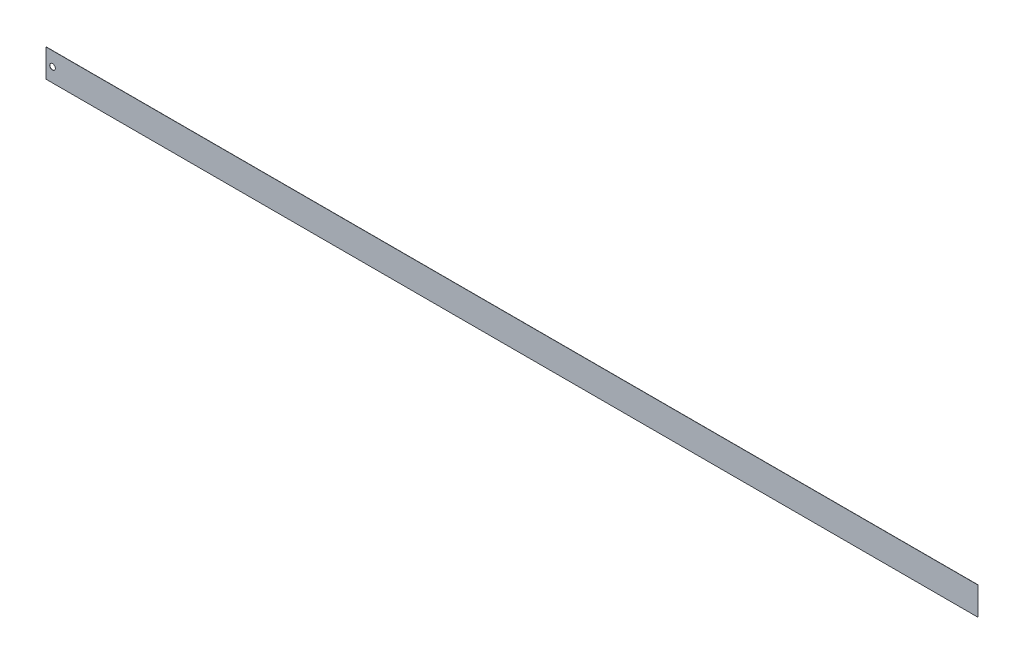
ISO-10303-21;
HEADER;
FILE_DESCRIPTION(('STEP AP214'),'2;1');
FILE_NAME('part.step','',(''),(''),'','','');
FILE_SCHEMA(('AUTOMOTIVE_DESIGN { 1 0 10303 214 1 1 1 1 }'));
ENDSEC;
DATA;
#1=APPLICATION_CONTEXT('core data for automotive mechanical design processes');
#2=APPLICATION_PROTOCOL_DEFINITION('international standard','automotive_design',2000,#1);
#3=PRODUCT_CONTEXT('',#1,'mechanical');
#4=PRODUCT('Part','Part','',(#3));
#5=PRODUCT_RELATED_PRODUCT_CATEGORY('part','',(#4));
#6=PRODUCT_DEFINITION_FORMATION('','',#4);
#7=PRODUCT_DEFINITION_CONTEXT('part definition',#1,'design');
#8=PRODUCT_DEFINITION('design','',#6,#7);
#9=PRODUCT_DEFINITION_SHAPE('','',#8);
#10=(LENGTH_UNIT() NAMED_UNIT(*) SI_UNIT(.MILLI.,.METRE.));
#11=(NAMED_UNIT(*) PLANE_ANGLE_UNIT() SI_UNIT($,.RADIAN.));
#12=(NAMED_UNIT(*) SI_UNIT($,.STERADIAN.) SOLID_ANGLE_UNIT());
#13=UNCERTAINTY_MEASURE_WITH_UNIT(LENGTH_MEASURE(1.E-05),#10,'distance_accuracy_value','');
#14=(GEOMETRIC_REPRESENTATION_CONTEXT(3) GLOBAL_UNCERTAINTY_ASSIGNED_CONTEXT((#13)) GLOBAL_UNIT_ASSIGNED_CONTEXT((#10,
#11,#12)) REPRESENTATION_CONTEXT('',''));
#15=CARTESIAN_POINT('',(0.,0.,0.));
#16=DIRECTION('',(0.,0.,1.));
#17=DIRECTION('',(1.,0.,0.));
#18=AXIS2_PLACEMENT_3D('',#15,#16,#17);
#19=CARTESIAN_POINT('',(0.,0.,0.1));
#20=DIRECTION('',(0.,0.,1.));
#21=DIRECTION('',(1.,0.,0.));
#22=AXIS2_PLACEMENT_3D('',#19,#20,#21);
#23=PLANE('',#22);
#24=DIRECTION('',(0.,-1.,0.));
#25=VECTOR('',#24,1.);
#26=CARTESIAN_POINT('',(-71.5183926645092,24.1197950377562,0.1));
#27=LINE('',#26,#25);
#28=CARTESIAN_POINT('',(-71.5183926645092,24.1197950377562,0.1));
#29=VERTEX_POINT('',#28);
#30=CARTESIAN_POINT('',(-71.5183926645092,9.1197950377562,0.1));
#31=VERTEX_POINT('',#30);
#32=EDGE_CURVE('E89',#29,#31,#27,.T.);
#33=ORIENTED_EDGE('',*,*,#32,.T.);
#34=DIRECTION('',(1.,0.,0.));
#35=VECTOR('',#34,1.);
#36=CARTESIAN_POINT('',(-71.5183926645092,9.1197950377562,0.1));
#37=LINE('',#36,#35);
#38=CARTESIAN_POINT('',(428.481607335491,9.1197950377562,0.1));
#39=VERTEX_POINT('',#38);
#40=EDGE_CURVE('E84',#31,#39,#37,.T.);
#41=ORIENTED_EDGE('',*,*,#40,.T.);
#42=DIRECTION('',(0.,1.,0.));
#43=VECTOR('',#42,1.);
#44=CARTESIAN_POINT('',(428.481607335491,24.1197950377562,0.1));
#45=LINE('',#44,#43);
#46=CARTESIAN_POINT('',(428.481607335491,24.1197950377562,0.1));
#47=VERTEX_POINT('',#46);
#48=EDGE_CURVE('E87',#39,#47,#45,.T.);
#49=ORIENTED_EDGE('',*,*,#48,.T.);
#50=DIRECTION('',(-1.,0.,0.));
#51=VECTOR('',#50,1.);
#52=CARTESIAN_POINT('',(-71.5183926645092,24.1197950377562,0.1));
#53=LINE('',#52,#51);
#54=EDGE_CURVE('E54',#47,#29,#53,.T.);
#55=ORIENTED_EDGE('',*,*,#54,.T.);
#56=EDGE_LOOP('',(#33,#41,#49,#55));
#57=FACE_BOUND('',#56,.T.);
#58=CARTESIAN_POINT('',(-68.0183926645092,16.6197950377562,0.1));
#59=DIRECTION('',(0.,0.,1.));
#60=DIRECTION('',(1.,0.,0.));
#61=AXIS2_PLACEMENT_3D('',#58,#59,#60);
#62=CIRCLE('',#61,1.5);
#63=CARTESIAN_POINT('',(-66.5183926645092,16.6197950377562,0.1));
#64=VERTEX_POINT('',#63);
#65=EDGE_CURVE('E104',#64,#64,#62,.T.);
#66=ORIENTED_EDGE('',*,*,#65,.F.);
#67=EDGE_LOOP('',(#66));
#68=FACE_BOUND('',#67,.T.);
#69=ADVANCED_FACE('F37',(#57,#68),#23,.T.);
#70=CARTESIAN_POINT('',(0.,0.,0.));
#71=DIRECTION('',(0.,0.,1.));
#72=DIRECTION('',(1.,0.,0.));
#73=AXIS2_PLACEMENT_3D('',#70,#71,#72);
#74=PLANE('',#73);
#75=DIRECTION('',(0.,-1.,0.));
#76=VECTOR('',#75,1.);
#77=CARTESIAN_POINT('',(-71.5183926645092,24.1197950377562,0.));
#78=LINE('',#77,#76);
#79=CARTESIAN_POINT('',(-71.5183926645092,24.1197950377562,0.));
#80=VERTEX_POINT('',#79);
#81=CARTESIAN_POINT('',(-71.5183926645092,9.1197950377562,0.));
#82=VERTEX_POINT('',#81);
#83=EDGE_CURVE('E101',#80,#82,#78,.T.);
#84=ORIENTED_EDGE('',*,*,#83,.F.);
#85=DIRECTION('',(-1.,0.,0.));
#86=VECTOR('',#85,1.);
#87=CARTESIAN_POINT('',(-71.5183926645092,24.1197950377562,0.));
#88=LINE('',#87,#86);
#89=CARTESIAN_POINT('',(428.481607335491,24.1197950377562,0.));
#90=VERTEX_POINT('',#89);
#91=EDGE_CURVE('E77',#90,#80,#88,.T.);
#92=ORIENTED_EDGE('',*,*,#91,.F.);
#93=DIRECTION('',(0.,1.,0.));
#94=VECTOR('',#93,1.);
#95=CARTESIAN_POINT('',(428.481607335491,24.1197950377562,0.));
#96=LINE('',#95,#94);
#97=CARTESIAN_POINT('',(428.481607335491,9.1197950377562,0.));
#98=VERTEX_POINT('',#97);
#99=EDGE_CURVE('E71',#98,#90,#96,.T.);
#100=ORIENTED_EDGE('',*,*,#99,.F.);
#101=DIRECTION('',(1.,0.,0.));
#102=VECTOR('',#101,1.);
#103=CARTESIAN_POINT('',(-71.5183926645092,9.1197950377562,0.));
#104=LINE('',#103,#102);
#105=EDGE_CURVE('E93',#82,#98,#104,.T.);
#106=ORIENTED_EDGE('',*,*,#105,.F.);
#107=EDGE_LOOP('',(#84,#92,#100,#106));
#108=FACE_BOUND('',#107,.T.);
#109=CARTESIAN_POINT('',(-68.0183926645092,16.6197950377562,0.));
#110=DIRECTION('',(0.,0.,1.));
#111=DIRECTION('',(1.,0.,0.));
#112=AXIS2_PLACEMENT_3D('',#109,#110,#111);
#113=CIRCLE('',#112,1.5);
#114=CARTESIAN_POINT('',(-66.5183926645092,16.6197950377562,0.));
#115=VERTEX_POINT('',#114);
#116=EDGE_CURVE('E116',#115,#115,#113,.T.);
#117=ORIENTED_EDGE('',*,*,#116,.T.);
#118=EDGE_LOOP('',(#117));
#119=FACE_BOUND('',#118,.T.);
#120=ADVANCED_FACE('F112',(#108,#119),#74,.F.);
#121=CARTESIAN_POINT('',(-71.5183926645092,24.1197950377562,0.1));
#122=DIRECTION('',(1.,0.,0.));
#123=DIRECTION('',(0.,0.,-1.));
#124=AXIS2_PLACEMENT_3D('',#121,#122,#123);
#125=PLANE('',#124);
#126=ORIENTED_EDGE('',*,*,#83,.T.);
#127=DIRECTION('',(0.,0.,-1.));
#128=VECTOR('',#127,1.);
#129=CARTESIAN_POINT('',(-71.5183926645092,9.1197950377562,0.1));
#130=LINE('',#129,#128);
#131=EDGE_CURVE('E11',#31,#82,#130,.T.);
#132=ORIENTED_EDGE('',*,*,#131,.F.);
#133=ORIENTED_EDGE('',*,*,#32,.F.);
#134=DIRECTION('',(0.,0.,-1.));
#135=VECTOR('',#134,1.);
#136=CARTESIAN_POINT('',(-71.5183926645092,24.1197950377562,0.1));
#137=LINE('',#136,#135);
#138=EDGE_CURVE('E97',#29,#80,#137,.T.);
#139=ORIENTED_EDGE('',*,*,#138,.T.);
#140=EDGE_LOOP('',(#126,#132,#133,#139));
#141=FACE_BOUND('',#140,.T.);
#142=ADVANCED_FACE('F39',(#141),#125,.F.);
#143=CARTESIAN_POINT('',(-71.5183926645092,9.1197950377562,0.1));
#144=DIRECTION('',(0.,1.,0.));
#145=DIRECTION('',(0.,0.,1.));
#146=AXIS2_PLACEMENT_3D('',#143,#144,#145);
#147=PLANE('',#146);
#148=ORIENTED_EDGE('',*,*,#105,.T.);
#149=DIRECTION('',(0.,0.,-1.));
#150=VECTOR('',#149,1.);
#151=CARTESIAN_POINT('',(428.481607335491,9.1197950377562,0.1));
#152=LINE('',#151,#150);
#153=EDGE_CURVE('E46',#39,#98,#152,.T.);
#154=ORIENTED_EDGE('',*,*,#153,.F.);
#155=ORIENTED_EDGE('',*,*,#40,.F.);
#156=ORIENTED_EDGE('',*,*,#131,.T.);
#157=EDGE_LOOP('',(#148,#154,#155,#156));
#158=FACE_BOUND('',#157,.T.);
#159=ADVANCED_FACE('F92',(#158),#147,.F.);
#160=CARTESIAN_POINT('',(428.481607335491,24.1197950377562,0.1));
#161=DIRECTION('',(-1.,0.,0.));
#162=DIRECTION('',(0.,0.,1.));
#163=AXIS2_PLACEMENT_3D('',#160,#161,#162);
#164=PLANE('',#163);
#165=ORIENTED_EDGE('',*,*,#99,.T.);
#166=DIRECTION('',(0.,0.,-1.));
#167=VECTOR('',#166,1.);
#168=CARTESIAN_POINT('',(428.481607335491,24.1197950377562,0.1));
#169=LINE('',#168,#167);
#170=EDGE_CURVE('E94',#47,#90,#169,.T.);
#171=ORIENTED_EDGE('',*,*,#170,.F.);
#172=ORIENTED_EDGE('',*,*,#48,.F.);
#173=ORIENTED_EDGE('',*,*,#153,.T.);
#174=EDGE_LOOP('',(#165,#171,#172,#173));
#175=FACE_BOUND('',#174,.T.);
#176=ADVANCED_FACE('F95',(#175),#164,.F.);
#177=CARTESIAN_POINT('',(-71.5183926645092,24.1197950377562,0.1));
#178=DIRECTION('',(0.,-1.,0.));
#179=DIRECTION('',(0.,0.,-1.));
#180=AXIS2_PLACEMENT_3D('',#177,#178,#179);
#181=PLANE('',#180);
#182=ORIENTED_EDGE('',*,*,#91,.T.);
#183=ORIENTED_EDGE('',*,*,#138,.F.);
#184=ORIENTED_EDGE('',*,*,#54,.F.);
#185=ORIENTED_EDGE('',*,*,#170,.T.);
#186=EDGE_LOOP('',(#182,#183,#184,#185));
#187=FACE_BOUND('',#186,.T.);
#188=ADVANCED_FACE('F109',(#187),#181,.F.);
#189=CARTESIAN_POINT('',(-68.0183926645092,16.6197950377562,0.1));
#190=DIRECTION('',(0.,0.,-1.));
#191=DIRECTION('',(-1.,0.,0.));
#192=AXIS2_PLACEMENT_3D('',#189,#190,#191);
#193=CYLINDRICAL_SURFACE('',#192,1.5);
#194=ORIENTED_EDGE('',*,*,#65,.T.);
#195=EDGE_LOOP('',(#194));
#196=FACE_BOUND('',#195,.T.);
#197=ORIENTED_EDGE('',*,*,#116,.F.);
#198=EDGE_LOOP('',(#197));
#199=FACE_BOUND('',#198,.T.);
#200=ADVANCED_FACE('F122',(#196,#199),#193,.F.);
#201=CLOSED_SHELL('',(#69,#120,#142,#159,#176,#188,#200));
#202=MANIFOLD_SOLID_BREP('B2',#201);
#203=ADVANCED_BREP_SHAPE_REPRESENTATION('',(#18,#202),#14);
#204=SHAPE_DEFINITION_REPRESENTATION(#9,#203);
ENDSEC;
END-ISO-10303-21;
